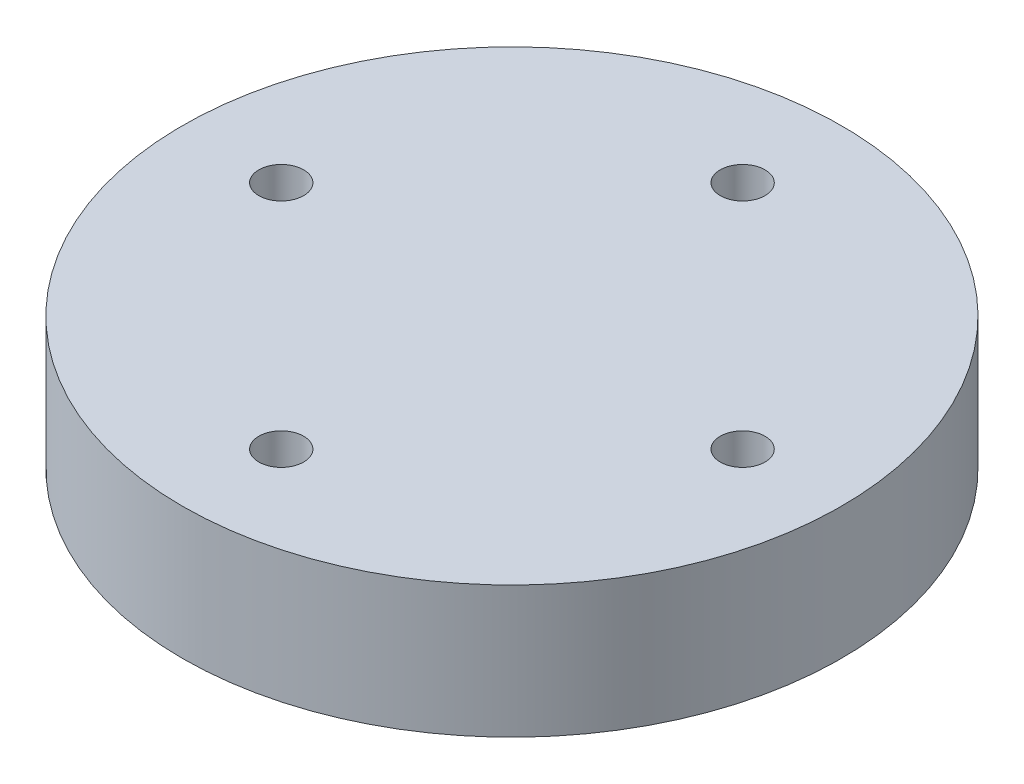
ISO-10303-21;
HEADER;
FILE_DESCRIPTION(('STEP AP214'),'2;1');
FILE_NAME('part.step','',(''),(''),'','','');
FILE_SCHEMA(('AUTOMOTIVE_DESIGN { 1 0 10303 214 1 1 1 1 }'));
ENDSEC;
DATA;
#1=APPLICATION_CONTEXT('core data for automotive mechanical design processes');
#2=APPLICATION_PROTOCOL_DEFINITION('international standard','automotive_design',2000,#1);
#3=PRODUCT_CONTEXT('',#1,'mechanical');
#4=PRODUCT('Part','Part','',(#3));
#5=PRODUCT_RELATED_PRODUCT_CATEGORY('part','',(#4));
#6=PRODUCT_DEFINITION_FORMATION('','',#4);
#7=PRODUCT_DEFINITION_CONTEXT('part definition',#1,'design');
#8=PRODUCT_DEFINITION('design','',#6,#7);
#9=PRODUCT_DEFINITION_SHAPE('','',#8);
#10=(LENGTH_UNIT() NAMED_UNIT(*) SI_UNIT(.MILLI.,.METRE.));
#11=(NAMED_UNIT(*) PLANE_ANGLE_UNIT() SI_UNIT($,.RADIAN.));
#12=(NAMED_UNIT(*) SI_UNIT($,.STERADIAN.) SOLID_ANGLE_UNIT());
#13=UNCERTAINTY_MEASURE_WITH_UNIT(LENGTH_MEASURE(1.E-05),#10,'distance_accuracy_value','');
#14=(GEOMETRIC_REPRESENTATION_CONTEXT(3) GLOBAL_UNCERTAINTY_ASSIGNED_CONTEXT((#13)) GLOBAL_UNIT_ASSIGNED_CONTEXT((#10,
#11,#12)) REPRESENTATION_CONTEXT('',''));
#15=CARTESIAN_POINT('',(0.,0.,0.));
#16=DIRECTION('',(0.,0.,1.));
#17=DIRECTION('',(1.,0.,0.));
#18=AXIS2_PLACEMENT_3D('',#15,#16,#17);
#19=CARTESIAN_POINT('',(0.,10.,0.));
#20=DIRECTION('',(0.,-1.,0.));
#21=DIRECTION('',(0.,0.,-1.));
#22=AXIS2_PLACEMENT_3D('',#19,#20,#21);
#23=CYLINDRICAL_SURFACE('',#22,25.);
#24=CARTESIAN_POINT('',(0.,10.,0.));
#25=DIRECTION('',(0.,1.,0.));
#26=DIRECTION('',(0.,0.,1.));
#27=AXIS2_PLACEMENT_3D('',#24,#25,#26);
#28=CIRCLE('',#27,25.);
#29=CARTESIAN_POINT('',(0.,10.,25.));
#30=VERTEX_POINT('',#29);
#31=EDGE_CURVE('E57',#30,#30,#28,.T.);
#32=ORIENTED_EDGE('',*,*,#31,.F.);
#33=EDGE_LOOP('',(#32));
#34=FACE_BOUND('',#33,.T.);
#35=CARTESIAN_POINT('',(0.,0.,0.));
#36=DIRECTION('',(0.,1.,0.));
#37=DIRECTION('',(0.,0.,1.));
#38=AXIS2_PLACEMENT_3D('',#35,#36,#37);
#39=CIRCLE('',#38,25.);
#40=CARTESIAN_POINT('',(0.,0.,25.));
#41=VERTEX_POINT('',#40);
#42=EDGE_CURVE('E60',#41,#41,#39,.T.);
#43=ORIENTED_EDGE('',*,*,#42,.T.);
#44=EDGE_LOOP('',(#43));
#45=FACE_BOUND('',#44,.T.);
#46=ADVANCED_FACE('F41',(#34,#45),#23,.T.);
#47=CARTESIAN_POINT('',(0.,10.,0.));
#48=DIRECTION('',(0.,1.,0.));
#49=DIRECTION('',(0.,0.,1.));
#50=AXIS2_PLACEMENT_3D('',#47,#48,#49);
#51=PLANE('',#50);
#52=CARTESIAN_POINT('',(-17.5,10.,0.));
#53=DIRECTION('',(0.,-1.,0.));
#54=DIRECTION('',(1.,0.,0.));
#55=AXIS2_PLACEMENT_3D('',#52,#53,#54);
#56=CIRCLE('',#55,1.7);
#57=CARTESIAN_POINT('',(-15.8,10.,0.));
#58=VERTEX_POINT('',#57);
#59=EDGE_CURVE('E75',#58,#58,#56,.T.);
#60=ORIENTED_EDGE('',*,*,#59,.T.);
#61=EDGE_LOOP('',(#60));
#62=FACE_BOUND('',#61,.T.);
#63=CARTESIAN_POINT('',(0.,10.,-17.5));
#64=DIRECTION('',(0.,-1.,0.));
#65=DIRECTION('',(0.,0.,1.));
#66=AXIS2_PLACEMENT_3D('',#63,#64,#65);
#67=CIRCLE('',#66,1.7);
#68=CARTESIAN_POINT('',(0.,10.,-15.8));
#69=VERTEX_POINT('',#68);
#70=EDGE_CURVE('E87',#69,#69,#67,.T.);
#71=ORIENTED_EDGE('',*,*,#70,.T.);
#72=EDGE_LOOP('',(#71));
#73=FACE_BOUND('',#72,.T.);
#74=CARTESIAN_POINT('',(17.5,10.,1.83302770289265E-13));
#75=DIRECTION('',(0.,-1.,0.));
#76=DIRECTION('',(-1.,0.,0.));
#77=AXIS2_PLACEMENT_3D('',#74,#75,#76);
#78=CIRCLE('',#77,1.7);
#79=CARTESIAN_POINT('',(15.8,10.,1.65496215461165E-13));
#80=VERTEX_POINT('',#79);
#81=EDGE_CURVE('E81',#80,#80,#78,.T.);
#82=ORIENTED_EDGE('',*,*,#81,.T.);
#83=EDGE_LOOP('',(#82));
#84=FACE_BOUND('',#83,.T.);
#85=CARTESIAN_POINT('',(0.,10.,17.5));
#86=DIRECTION('',(0.,-1.,0.));
#87=DIRECTION('',(0.,0.,-1.));
#88=AXIS2_PLACEMENT_3D('',#85,#86,#87);
#89=CIRCLE('',#88,1.7);
#90=CARTESIAN_POINT('',(0.,10.,15.8));
#91=VERTEX_POINT('',#90);
#92=EDGE_CURVE('E71',#91,#91,#89,.T.);
#93=ORIENTED_EDGE('',*,*,#92,.T.);
#94=EDGE_LOOP('',(#93));
#95=FACE_BOUND('',#94,.T.);
#96=ORIENTED_EDGE('',*,*,#31,.T.);
#97=EDGE_LOOP('',(#96));
#98=FACE_BOUND('',#97,.T.);
#99=ADVANCED_FACE('F96',(#62,#73,#84,#95,#98),#51,.T.);
#100=CARTESIAN_POINT('',(0.,0.,0.));
#101=DIRECTION('',(0.,1.,0.));
#102=DIRECTION('',(0.,0.,1.));
#103=AXIS2_PLACEMENT_3D('',#100,#101,#102);
#104=PLANE('',#103);
#105=CARTESIAN_POINT('',(-17.5,0.,0.));
#106=DIRECTION('',(0.,-1.,0.));
#107=DIRECTION('',(1.,0.,0.));
#108=AXIS2_PLACEMENT_3D('',#105,#106,#107);
#109=CIRCLE('',#108,1.7);
#110=CARTESIAN_POINT('',(-15.8,0.,0.));
#111=VERTEX_POINT('',#110);
#112=EDGE_CURVE('E90',#111,#111,#109,.T.);
#113=ORIENTED_EDGE('',*,*,#112,.F.);
#114=EDGE_LOOP('',(#113));
#115=FACE_BOUND('',#114,.T.);
#116=CARTESIAN_POINT('',(0.,0.,-17.5));
#117=DIRECTION('',(0.,-1.,0.));
#118=DIRECTION('',(0.,0.,1.));
#119=AXIS2_PLACEMENT_3D('',#116,#117,#118);
#120=CIRCLE('',#119,1.7);
#121=CARTESIAN_POINT('',(0.,0.,-15.8));
#122=VERTEX_POINT('',#121);
#123=EDGE_CURVE('E84',#122,#122,#120,.T.);
#124=ORIENTED_EDGE('',*,*,#123,.F.);
#125=EDGE_LOOP('',(#124));
#126=FACE_BOUND('',#125,.T.);
#127=CARTESIAN_POINT('',(17.5,0.,1.83302770289265E-13));
#128=DIRECTION('',(0.,-1.,0.));
#129=DIRECTION('',(-1.,0.,0.));
#130=AXIS2_PLACEMENT_3D('',#127,#128,#129);
#131=CIRCLE('',#130,1.7);
#132=CARTESIAN_POINT('',(15.8,0.,1.65496215461165E-13));
#133=VERTEX_POINT('',#132);
#134=EDGE_CURVE('E78',#133,#133,#131,.T.);
#135=ORIENTED_EDGE('',*,*,#134,.F.);
#136=EDGE_LOOP('',(#135));
#137=FACE_BOUND('',#136,.T.);
#138=CARTESIAN_POINT('',(0.,0.,17.5));
#139=DIRECTION('',(0.,-1.,0.));
#140=DIRECTION('',(0.,0.,-1.));
#141=AXIS2_PLACEMENT_3D('',#138,#139,#140);
#142=CIRCLE('',#141,1.7);
#143=CARTESIAN_POINT('',(0.,0.,15.8));
#144=VERTEX_POINT('',#143);
#145=EDGE_CURVE('E72',#144,#144,#142,.T.);
#146=ORIENTED_EDGE('',*,*,#145,.F.);
#147=EDGE_LOOP('',(#146));
#148=FACE_BOUND('',#147,.T.);
#149=CARTESIAN_POINT('',(0.,0.,0.));
#150=DIRECTION('',(0.,1.,0.));
#151=DIRECTION('',(0.,0.,1.));
#152=AXIS2_PLACEMENT_3D('',#149,#150,#151);
#153=CIRCLE('',#152,13.);
#154=CARTESIAN_POINT('',(0.,0.,13.));
#155=VERTEX_POINT('',#154);
#156=EDGE_CURVE('E53',#155,#155,#153,.F.);
#157=ORIENTED_EDGE('',*,*,#156,.F.);
#158=EDGE_LOOP('',(#157));
#159=FACE_BOUND('',#158,.T.);
#160=ORIENTED_EDGE('',*,*,#42,.F.);
#161=EDGE_LOOP('',(#160));
#162=FACE_BOUND('',#161,.T.);
#163=ADVANCED_FACE('F106',(#115,#126,#137,#148,#159,#162),#104,.F.);
#164=CARTESIAN_POINT('',(0.,-2.,0.));
#165=DIRECTION('',(0.,-1.,0.));
#166=DIRECTION('',(0.,0.,-1.));
#167=AXIS2_PLACEMENT_3D('',#164,#165,#166);
#168=PLANE('',#167);
#169=CARTESIAN_POINT('',(0.,-2.,0.));
#170=DIRECTION('',(0.,-1.,0.));
#171=DIRECTION('',(0.,0.,-1.));
#172=AXIS2_PLACEMENT_3D('',#169,#170,#171);
#173=CIRCLE('',#172,12.);
#174=CARTESIAN_POINT('',(0.,-2.,-12.));
#175=VERTEX_POINT('',#174);
#176=EDGE_CURVE('E49',#175,#175,#173,.T.);
#177=ORIENTED_EDGE('',*,*,#176,.T.);
#178=EDGE_LOOP('',(#177));
#179=FACE_BOUND('',#178,.T.);
#180=CARTESIAN_POINT('',(0.,-2.,0.));
#181=DIRECTION('',(0.,-1.,0.));
#182=DIRECTION('',(0.,0.,-1.));
#183=AXIS2_PLACEMENT_3D('',#180,#181,#182);
#184=CIRCLE('',#183,11.);
#185=CARTESIAN_POINT('',(0.,-2.,-11.));
#186=VERTEX_POINT('',#185);
#187=EDGE_CURVE('E63',#186,#186,#184,.T.);
#188=ORIENTED_EDGE('',*,*,#187,.F.);
#189=EDGE_LOOP('',(#188));
#190=FACE_BOUND('',#189,.T.);
#191=ADVANCED_FACE('F109',(#179,#190),#168,.T.);
#192=CARTESIAN_POINT('',(0.,-2.,0.));
#193=DIRECTION('',(0.,1.,0.));
#194=DIRECTION('',(0.,0.,1.));
#195=AXIS2_PLACEMENT_3D('',#192,#193,#194);
#196=CYLINDRICAL_SURFACE('',#195,13.);
#197=CARTESIAN_POINT('',(0.,-0.999999999999999,0.));
#198=DIRECTION('',(0.,-1.,0.));
#199=DIRECTION('',(0.,0.,-1.));
#200=AXIS2_PLACEMENT_3D('',#197,#198,#199);
#201=CIRCLE('',#200,13.);
#202=CARTESIAN_POINT('',(0.,-0.999999999999999,-13.));
#203=VERTEX_POINT('',#202);
#204=EDGE_CURVE('E10',#203,#203,#201,.F.);
#205=ORIENTED_EDGE('',*,*,#204,.T.);
#206=EDGE_LOOP('',(#205));
#207=FACE_BOUND('',#206,.T.);
#208=ORIENTED_EDGE('',*,*,#156,.T.);
#209=EDGE_LOOP('',(#208));
#210=FACE_BOUND('',#209,.T.);
#211=ADVANCED_FACE('F130',(#207,#210),#196,.T.);
#212=CARTESIAN_POINT('',(0.,-2.,0.));
#213=DIRECTION('',(0.,1.,0.));
#214=DIRECTION('',(0.,0.,1.));
#215=AXIS2_PLACEMENT_3D('',#212,#213,#214);
#216=CYLINDRICAL_SURFACE('',#215,11.);
#217=ORIENTED_EDGE('',*,*,#187,.T.);
#218=EDGE_LOOP('',(#217));
#219=FACE_BOUND('',#218,.T.);
#220=CARTESIAN_POINT('',(0.,8.,0.));
#221=DIRECTION('',(0.,1.,0.));
#222=DIRECTION('',(0.,0.,1.));
#223=AXIS2_PLACEMENT_3D('',#220,#221,#222);
#224=CIRCLE('',#223,11.);
#225=CARTESIAN_POINT('',(0.,8.,11.));
#226=VERTEX_POINT('',#225);
#227=EDGE_CURVE('E68',#226,#226,#224,.T.);
#228=ORIENTED_EDGE('',*,*,#227,.T.);
#229=EDGE_LOOP('',(#228));
#230=FACE_BOUND('',#229,.T.);
#231=ADVANCED_FACE('F133',(#219,#230),#216,.F.);
#232=CARTESIAN_POINT('',(0.,8.,0.));
#233=DIRECTION('',(0.,1.,0.));
#234=DIRECTION('',(0.,0.,1.));
#235=AXIS2_PLACEMENT_3D('',#232,#233,#234);
#236=PLANE('',#235);
#237=ORIENTED_EDGE('',*,*,#227,.F.);
#238=EDGE_LOOP('',(#237));
#239=FACE_BOUND('',#238,.T.);
#240=ADVANCED_FACE('F137',(#239),#236,.F.);
#241=CARTESIAN_POINT('',(0.,-2.,0.));
#242=DIRECTION('',(0.,1.,0.));
#243=DIRECTION('',(0.,0.,1.));
#244=AXIS2_PLACEMENT_3D('',#241,#242,#243);
#245=CONICAL_SURFACE('',#244,12.,0.785398163397447);
#246=ORIENTED_EDGE('',*,*,#204,.F.);
#247=EDGE_LOOP('',(#246));
#248=FACE_BOUND('',#247,.T.);
#249=ORIENTED_EDGE('',*,*,#176,.F.);
#250=EDGE_LOOP('',(#249));
#251=FACE_BOUND('',#250,.T.);
#252=ADVANCED_FACE('F44',(#248,#251),#245,.T.);
#253=CARTESIAN_POINT('',(0.,10.,17.5));
#254=DIRECTION('',(0.,-1.,0.));
#255=DIRECTION('',(0.,0.,-1.));
#256=AXIS2_PLACEMENT_3D('',#253,#254,#255);
#257=CYLINDRICAL_SURFACE('',#256,1.7);
#258=ORIENTED_EDGE('',*,*,#92,.F.);
#259=EDGE_LOOP('',(#258));
#260=FACE_BOUND('',#259,.T.);
#261=ORIENTED_EDGE('',*,*,#145,.T.);
#262=EDGE_LOOP('',(#261));
#263=FACE_BOUND('',#262,.T.);
#264=ADVANCED_FACE('F142',(#260,#263),#257,.F.);
#265=CARTESIAN_POINT('',(17.5,10.,1.83302770289265E-13));
#266=DIRECTION('',(0.,-1.,0.));
#267=DIRECTION('',(0.,0.,-1.));
#268=AXIS2_PLACEMENT_3D('',#265,#266,#267);
#269=CYLINDRICAL_SURFACE('',#268,1.7);
#270=ORIENTED_EDGE('',*,*,#81,.F.);
#271=EDGE_LOOP('',(#270));
#272=FACE_BOUND('',#271,.T.);
#273=ORIENTED_EDGE('',*,*,#134,.T.);
#274=EDGE_LOOP('',(#273));
#275=FACE_BOUND('',#274,.T.);
#276=ADVANCED_FACE('F145',(#272,#275),#269,.F.);
#277=CARTESIAN_POINT('',(0.,10.,-17.5));
#278=DIRECTION('',(0.,-1.,0.));
#279=DIRECTION('',(0.,0.,-1.));
#280=AXIS2_PLACEMENT_3D('',#277,#278,#279);
#281=CYLINDRICAL_SURFACE('',#280,1.7);
#282=ORIENTED_EDGE('',*,*,#70,.F.);
#283=EDGE_LOOP('',(#282));
#284=FACE_BOUND('',#283,.T.);
#285=ORIENTED_EDGE('',*,*,#123,.T.);
#286=EDGE_LOOP('',(#285));
#287=FACE_BOUND('',#286,.T.);
#288=ADVANCED_FACE('F102',(#284,#287),#281,.F.);
#289=CARTESIAN_POINT('',(-17.5,10.,0.));
#290=DIRECTION('',(0.,-1.,0.));
#291=DIRECTION('',(0.,0.,-1.));
#292=AXIS2_PLACEMENT_3D('',#289,#290,#291);
#293=CYLINDRICAL_SURFACE('',#292,1.7);
#294=ORIENTED_EDGE('',*,*,#59,.F.);
#295=EDGE_LOOP('',(#294));
#296=FACE_BOUND('',#295,.T.);
#297=ORIENTED_EDGE('',*,*,#112,.T.);
#298=EDGE_LOOP('',(#297));
#299=FACE_BOUND('',#298,.T.);
#300=ADVANCED_FACE('F99',(#296,#299),#293,.F.);
#301=CLOSED_SHELL('',(#46,#99,#163,#191,#211,#231,#240,#252,#264,#276,#288,#300));
#302=MANIFOLD_SOLID_BREP('B2',#301);
#303=ADVANCED_BREP_SHAPE_REPRESENTATION('',(#18,#302),#14);
#304=SHAPE_DEFINITION_REPRESENTATION(#9,#303);
ENDSEC;
END-ISO-10303-21;
